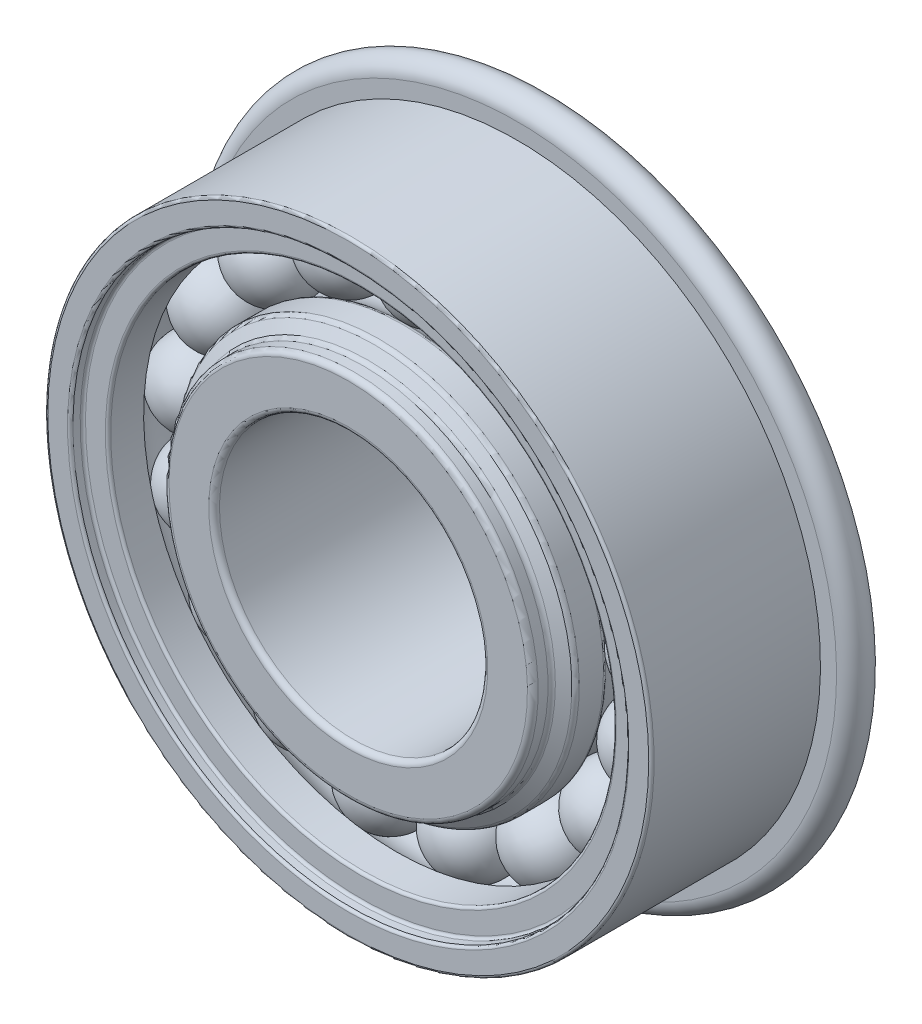
ISO-10303-21;
HEADER;
FILE_DESCRIPTION(('STEP AP214'),'2;1');
FILE_NAME('part.step','',(''),(''),'','','');
FILE_SCHEMA(('AUTOMOTIVE_DESIGN { 1 0 10303 214 1 1 1 1 }'));
ENDSEC;
DATA;
#1=APPLICATION_CONTEXT('core data for automotive mechanical design processes');
#2=APPLICATION_PROTOCOL_DEFINITION('international standard','automotive_design',2000,#1);
#3=PRODUCT_CONTEXT('',#1,'mechanical');
#4=PRODUCT('Part','Part','',(#3));
#5=PRODUCT_RELATED_PRODUCT_CATEGORY('part','',(#4));
#6=PRODUCT_DEFINITION_FORMATION('','',#4);
#7=PRODUCT_DEFINITION_CONTEXT('part definition',#1,'design');
#8=PRODUCT_DEFINITION('design','',#6,#7);
#9=PRODUCT_DEFINITION_SHAPE('','',#8);
#10=(LENGTH_UNIT() NAMED_UNIT(*) SI_UNIT(.MILLI.,.METRE.));
#11=(NAMED_UNIT(*) PLANE_ANGLE_UNIT() SI_UNIT($,.RADIAN.));
#12=(NAMED_UNIT(*) SI_UNIT($,.STERADIAN.) SOLID_ANGLE_UNIT());
#13=UNCERTAINTY_MEASURE_WITH_UNIT(LENGTH_MEASURE(1.E-05),#10,'distance_accuracy_value','');
#14=(GEOMETRIC_REPRESENTATION_CONTEXT(3) GLOBAL_UNCERTAINTY_ASSIGNED_CONTEXT((#13)) GLOBAL_UNIT_ASSIGNED_CONTEXT((#10,
#11,#12)) REPRESENTATION_CONTEXT('',''));
#15=CARTESIAN_POINT('',(0.,0.,0.));
#16=DIRECTION('',(0.,0.,1.));
#17=DIRECTION('',(1.,0.,0.));
#18=AXIS2_PLACEMENT_3D('',#15,#16,#17);
#19=CARTESIAN_POINT('',(-3.9649794970284,10.2347918781365,1.55575));
#20=DIRECTION('',(-0.361241666187141,0.932472229404361,0.));
#21=DIRECTION('',(0.,0.,-1.));
#22=AXIS2_PLACEMENT_3D('',#19,#20,#21);
#23=SPHERICAL_SURFACE('',#22,1.984375);
#24=CARTESIAN_POINT('',(-4.68181842836851,12.0851664583608,1.55575));
#25=VERTEX_POINT('',#24);
#26=VERTEX_LOOP('',#25);
#27=FACE_BOUND('',#26,.T.);
#28=ADVANCED_FACE('F46',(#27),#23,.T.);
#29=CLOSED_SHELL('',(#28));
#30=MANIFOLD_SOLID_BREP('B2',#29);
#31=CARTESIAN_POINT('',(-7.39446654227342,8.11134340019112,1.55575));
#32=DIRECTION('',(-0.673695643646548,0.739008917220668,0.));
#33=DIRECTION('',(0.,0.,-1.));
#34=AXIS2_PLACEMENT_3D('',#31,#32,#33);
#35=SPHERICAL_SURFACE('',#34,1.984375);
#36=CARTESIAN_POINT('',(-8.73133133513454,9.57781422030088,1.55575));
#37=VERTEX_POINT('',#36);
#38=VERTEX_LOOP('',#37);
#39=FACE_BOUND('',#38,.T.);
#40=ADVANCED_FACE('F63',(#39),#35,.T.);
#41=CLOSED_SHELL('',(#40));
#42=MANIFOLD_SOLID_BREP('B6',#41);
#43=CARTESIAN_POINT('',(-9.82528990683082,4.89241304954451,1.55575));
#44=DIRECTION('',(-0.895163291355057,0.445738355776549,0.));
#45=DIRECTION('',(0.,0.,-1.));
#46=AXIS2_PLACEMENT_3D('',#43,#44,#45);
#47=SPHERICAL_SURFACE('',#46,1.984375);
#48=CARTESIAN_POINT('',(-11.6016295631135,5.7769250992886,1.55575));
#49=VERTEX_POINT('',#48);
#50=VERTEX_LOOP('',#49);
#51=FACE_BOUND('',#50,.T.);
#52=ADVANCED_FACE('F84',(#51),#47,.T.);
#53=CLOSED_SHELL('',(#52));
#54=MANIFOLD_SOLID_BREP('B45',#53);
#55=CARTESIAN_POINT('',(-10.9291534256599,1.01273520676034,1.55575));
#56=DIRECTION('',(-0.995734176295033,0.092268359463313,0.));
#57=DIRECTION('',(0.,0.,-1.));
#58=AXIS2_PLACEMENT_3D('',#55,#56,#57);
#59=SPHERICAL_SURFACE('',#58,1.984375);
#60=CARTESIAN_POINT('',(-12.9050634317453,1.19583023257035,1.55575));
#61=VERTEX_POINT('',#60);
#62=VERTEX_LOOP('',#61);
#63=FACE_BOUND('',#62,.T.);
#64=ADVANCED_FACE('F105',(#63),#59,.T.);
#65=CLOSED_SHELL('',(#64));
#66=MANIFOLD_SOLID_BREP('B62',#65);
#67=CARTESIAN_POINT('',(-10.5569742138238,-3.00371813745632,1.55575));
#68=DIRECTION('',(-0.961825643172822,-0.273662990072073,0.));
#69=DIRECTION('',(0.,0.,-1.));
#70=AXIS2_PLACEMENT_3D('',#67,#68,#69);
#71=SPHERICAL_SURFACE('',#70,1.984375);
#72=CARTESIAN_POINT('',(-12.4655969744949,-3.54676813338059,1.55575));
#73=VERTEX_POINT('',#72);
#74=VERTEX_LOOP('',#73);
#75=FACE_BOUND('',#74,.T.);
#76=ADVANCED_FACE('F125',(#75),#71,.T.);
#77=CLOSED_SHELL('',(#76));
#78=MANIFOLD_SOLID_BREP('B77',#77);
#79=CARTESIAN_POINT('',(-8.75901713619728,-6.61450270303273,1.55575));
#80=DIRECTION('',(-0.798017227280245,-0.602634636379249,0.));
#81=DIRECTION('',(0.,0.,-1.));
#82=AXIS2_PLACEMENT_3D('',#79,#80,#81);
#83=SPHERICAL_SURFACE('',#82,1.984375);
#84=CARTESIAN_POINT('',(-10.3425825715815,-7.81035580959781,1.55575));
#85=VERTEX_POINT('',#84);
#86=VERTEX_LOOP('',#85);
#87=FACE_BOUND('',#86,.T.);
#88=ADVANCED_FACE('F142',(#87),#83,.T.);
#89=CLOSED_SHELL('',(#88));
#90=MANIFOLD_SOLID_BREP('B97',#89);
#91=CARTESIAN_POINT('',(-5.77810625893786,-9.33196202633981,1.55575));
#92=DIRECTION('',(-0.526432162877363,-0.85021713572961,0.));
#93=DIRECTION('',(0.,0.,-1.));
#94=AXIS2_PLACEMENT_3D('',#91,#92,#93);
#95=SPHERICAL_SURFACE('',#94,1.984375);
#96=CARTESIAN_POINT('',(-6.82274508214763,-11.0191116550533,1.55575));
#97=VERTEX_POINT('',#96);
#98=VERTEX_LOOP('',#97);
#99=FACE_BOUND('',#98,.T.);
#100=ADVANCED_FACE('F158',(#99),#95,.T.);
#101=CLOSED_SHELL('',(#100));
#102=MANIFOLD_SOLID_BREP('B118',#101);
#103=CARTESIAN_POINT('',(-2.01683011381681,-10.789088167803,1.55575));
#104=DIRECTION('',(-0.183749517816578,-0.9829730996839,0.));
#105=DIRECTION('',(0.,0.,-1.));
#106=AXIS2_PLACEMENT_3D('',#103,#104,#105);
#107=SPHERICAL_SURFACE('',#106,1.984375);
#108=CARTESIAN_POINT('',(-2.38145806323408,-12.7396754124882,1.55575));
#109=VERTEX_POINT('',#108);
#110=VERTEX_LOOP('',#109);
#111=FACE_BOUND('',#110,.T.);
#112=ADVANCED_FACE('F178',(#111),#107,.T.);
#113=CLOSED_SHELL('',(#112));
#114=MANIFOLD_SOLID_BREP('B140',#113);
#115=CARTESIAN_POINT('',(2.01683011381666,-10.789088167803,1.55575));
#116=DIRECTION('',(0.183749517816564,-0.982973099683903,0.));
#117=DIRECTION('',(0.,0.,-1.));
#118=AXIS2_PLACEMENT_3D('',#115,#116,#117);
#119=SPHERICAL_SURFACE('',#118,1.984375);
#120=CARTESIAN_POINT('',(2.3814580632339,-12.7396754124883,1.55575));
#121=VERTEX_POINT('',#120);
#122=VERTEX_LOOP('',#121);
#123=FACE_BOUND('',#122,.T.);
#124=ADVANCED_FACE('F198',(#123),#119,.T.);
#125=CLOSED_SHELL('',(#124));
#126=MANIFOLD_SOLID_BREP('B157',#125);
#127=CARTESIAN_POINT('',(5.77810625893773,-9.33196202633989,1.55575));
#128=DIRECTION('',(0.526432162877351,-0.850217135729617,0.));
#129=DIRECTION('',(0.,0.,-1.));
#130=AXIS2_PLACEMENT_3D('',#127,#128,#129);
#131=SPHERICAL_SURFACE('',#130,1.984375);
#132=CARTESIAN_POINT('',(6.82274508214747,-11.0191116550533,1.55575));
#133=VERTEX_POINT('',#132);
#134=VERTEX_LOOP('',#133);
#135=FACE_BOUND('',#134,.T.);
#136=ADVANCED_FACE('F219',(#135),#131,.T.);
#137=CLOSED_SHELL('',(#136));
#138=MANIFOLD_SOLID_BREP('B174',#137);
#139=CARTESIAN_POINT('',(8.75901713619719,-6.61450270303286,1.55575));
#140=DIRECTION('',(0.798017227280236,-0.602634636379261,0.));
#141=DIRECTION('',(0.,0.,-1.));
#142=AXIS2_PLACEMENT_3D('',#139,#140,#141);
#143=SPHERICAL_SURFACE('',#142,1.984375);
#144=CARTESIAN_POINT('',(10.3425825715814,-7.81035580959795,1.55575));
#145=VERTEX_POINT('',#144);
#146=VERTEX_LOOP('',#145);
#147=FACE_BOUND('',#146,.T.);
#148=ADVANCED_FACE('F237',(#147),#143,.T.);
#149=CLOSED_SHELL('',(#148));
#150=MANIFOLD_SOLID_BREP('B192',#149);
#151=CARTESIAN_POINT('',(10.5569742138238,-3.00371813745647,1.55575));
#152=DIRECTION('',(0.961825643172818,-0.273662990072087,0.));
#153=DIRECTION('',(0.,0.,-1.));
#154=AXIS2_PLACEMENT_3D('',#151,#152,#153);
#155=SPHERICAL_SURFACE('',#154,1.984375);
#156=CARTESIAN_POINT('',(12.4655969744948,-3.54676813338077,1.55575));
#157=VERTEX_POINT('',#156);
#158=VERTEX_LOOP('',#157);
#159=FACE_BOUND('',#158,.T.);
#160=ADVANCED_FACE('F252',(#159),#155,.T.);
#161=CLOSED_SHELL('',(#160));
#162=MANIFOLD_SOLID_BREP('B214',#161);
#163=CARTESIAN_POINT('',(10.9291534256599,1.01273520676018,1.55575));
#164=DIRECTION('',(0.995734176295035,0.0922683594632987,0.));
#165=DIRECTION('',(0.,0.,-1.));
#166=AXIS2_PLACEMENT_3D('',#163,#164,#165);
#167=SPHERICAL_SURFACE('',#166,1.984375);
#168=CARTESIAN_POINT('',(12.9050634317454,1.19583023257016,1.55575));
#169=VERTEX_POINT('',#168);
#170=VERTEX_LOOP('',#169);
#171=FACE_BOUND('',#170,.T.);
#172=ADVANCED_FACE('F272',(#171),#167,.T.);
#173=CLOSED_SHELL('',(#172));
#174=MANIFOLD_SOLID_BREP('B235',#173);
#175=CARTESIAN_POINT('',(9.82528990683089,4.89241304954436,1.55575));
#176=DIRECTION('',(0.895163291355063,0.445738355776536,0.));
#177=DIRECTION('',(0.,0.,-1.));
#178=AXIS2_PLACEMENT_3D('',#175,#176,#177);
#179=SPHERICAL_SURFACE('',#178,1.984375);
#180=CARTESIAN_POINT('',(11.6016295631136,5.77692509928843,1.55575));
#181=VERTEX_POINT('',#180);
#182=VERTEX_LOOP('',#181);
#183=FACE_BOUND('',#182,.T.);
#184=ADVANCED_FACE('F295',(#183),#179,.T.);
#185=CLOSED_SHELL('',(#184));
#186=MANIFOLD_SOLID_BREP('B254',#185);
#187=CARTESIAN_POINT('',(7.39446654227353,8.11134340019101,1.55575));
#188=DIRECTION('',(0.673695643646558,0.739008917220658,0.));
#189=DIRECTION('',(0.,0.,-1.));
#190=AXIS2_PLACEMENT_3D('',#187,#188,#189);
#191=SPHERICAL_SURFACE('',#190,1.984375);
#192=CARTESIAN_POINT('',(8.73133133513467,9.57781422030076,1.55575));
#193=VERTEX_POINT('',#192);
#194=VERTEX_LOOP('',#193);
#195=FACE_BOUND('',#194,.T.);
#196=ADVANCED_FACE('F315',(#195),#191,.T.);
#197=CLOSED_SHELL('',(#196));
#198=MANIFOLD_SOLID_BREP('B269',#197);
#199=CARTESIAN_POINT('',(3.96497949702854,10.2347918781365,1.55575));
#200=DIRECTION('',(0.361241666187154,0.932472229404355,0.));
#201=DIRECTION('',(0.,0.,-1.));
#202=AXIS2_PLACEMENT_3D('',#199,#200,#201);
#203=SPHERICAL_SURFACE('',#202,1.984375);
#204=CARTESIAN_POINT('',(4.68181842836868,12.0851664583607,1.55575));
#205=VERTEX_POINT('',#204);
#206=VERTEX_LOOP('',#205);
#207=FACE_BOUND('',#206,.T.);
#208=ADVANCED_FACE('F333',(#207),#203,.T.);
#209=CLOSED_SHELL('',(#208));
#210=MANIFOLD_SOLID_BREP('B286',#209);
#211=CARTESIAN_POINT('',(0.,10.975975,1.55575));
#212=DIRECTION('',(0.,1.,0.));
#213=DIRECTION('',(0.,0.,-1.));
#214=AXIS2_PLACEMENT_3D('',#211,#212,#213);
#215=SPHERICAL_SURFACE('',#214,1.984375);
#216=CARTESIAN_POINT('',(0.,12.96035,1.55575));
#217=VERTEX_POINT('',#216);
#218=VERTEX_LOOP('',#217);
#219=FACE_BOUND('',#218,.T.);
#220=ADVANCED_FACE('F355',(#219),#215,.T.);
#221=CLOSED_SHELL('',(#220));
#222=MANIFOLD_SOLID_BREP('B306',#221);
#223=CARTESIAN_POINT('',(0.,8.7376,-5.55625));
#224=DIRECTION('',(0.,0.,1.));
#225=DIRECTION('',(0.,-1.,0.));
#226=AXIS2_PLACEMENT_3D('',#223,#224,#225);
#227=PLANE('',#226);
#228=CARTESIAN_POINT('',(0.,0.,-5.55625));
#229=DIRECTION('',(0.,0.,1.));
#230=DIRECTION('',(0.,-1.,0.));
#231=AXIS2_PLACEMENT_3D('',#228,#229,#230);
#232=CIRCLE('',#231,7.89273360666771);
#233=CARTESIAN_POINT('',(0.,-7.89273360666771,-5.55625));
#234=VERTEX_POINT('',#233);
#235=EDGE_CURVE('E351',#234,#234,#232,.F.);
#236=ORIENTED_EDGE('',*,*,#235,.T.);
#237=EDGE_LOOP('',(#236));
#238=FACE_BOUND('',#237,.T.);
#239=CARTESIAN_POINT('',(0.,0.,-5.55625));
#240=DIRECTION('',(0.,0.,1.));
#241=DIRECTION('',(0.,-1.,0.));
#242=AXIS2_PLACEMENT_3D('',#239,#240,#241);
#243=CIRCLE('',#242,7.69775385926724);
#244=CARTESIAN_POINT('',(0.,-7.69775385926724,-5.55625));
#245=VERTEX_POINT('',#244);
#246=EDGE_CURVE('E449',#245,#245,#243,.T.);
#247=ORIENTED_EDGE('',*,*,#246,.T.);
#248=EDGE_LOOP('',(#247));
#249=FACE_BOUND('',#248,.T.);
#250=ADVANCED_FACE('F375',(#238,#249),#227,.F.);
#251=CARTESIAN_POINT('',(0.,0.,5.55625));
#252=DIRECTION('',(0.,0.,1.));
#253=DIRECTION('',(0.,-1.,0.));
#254=AXIS2_PLACEMENT_3D('',#251,#252,#253);
#255=CYLINDRICAL_SURFACE('',#254,8.7376);
#256=CARTESIAN_POINT('',(0.,0.,-5.10328333333334));
#257=DIRECTION('',(0.,0.,-1.));
#258=DIRECTION('',(0.,1.,0.));
#259=AXIS2_PLACEMENT_3D('',#256,#257,#258);
#260=CIRCLE('',#259,8.7376);
#261=CARTESIAN_POINT('',(0.,8.7376,-5.10328333333333));
#262=VERTEX_POINT('',#261);
#263=EDGE_CURVE('E444',#262,#262,#260,.F.);
#264=ORIENTED_EDGE('',*,*,#263,.T.);
#265=EDGE_LOOP('',(#264));
#266=FACE_BOUND('',#265,.T.);
#267=CARTESIAN_POINT('',(0.,0.,-2.59139696837417));
#268=DIRECTION('',(0.,0.,1.));
#269=DIRECTION('',(0.,-1.,0.));
#270=AXIS2_PLACEMENT_3D('',#267,#268,#269);
#271=CIRCLE('',#270,8.7376);
#272=CARTESIAN_POINT('',(0.,-8.7376,-2.59139696837417));
#273=VERTEX_POINT('',#272);
#274=EDGE_CURVE('E448',#273,#273,#271,.F.);
#275=ORIENTED_EDGE('',*,*,#274,.T.);
#276=EDGE_LOOP('',(#275));
#277=FACE_BOUND('',#276,.T.);
#278=ADVANCED_FACE('F510',(#266,#277),#255,.T.);
#279=CARTESIAN_POINT('',(0.,0.,5.55625));
#280=DIRECTION('',(0.,0.,1.));
#281=DIRECTION('',(0.,-1.,0.));
#282=AXIS2_PLACEMENT_3D('',#279,#280,#281);
#283=CYLINDRICAL_SURFACE('',#282,6.35);
#284=CARTESIAN_POINT('',(0.,0.,5.30225));
#285=DIRECTION('',(0.,0.,-1.));
#286=DIRECTION('',(0.,1.,0.));
#287=AXIS2_PLACEMENT_3D('',#284,#285,#286);
#288=CIRCLE('',#287,6.35);
#289=CARTESIAN_POINT('',(0.,6.35,5.30225));
#290=VERTEX_POINT('',#289);
#291=EDGE_CURVE('E377',#290,#290,#288,.F.);
#292=ORIENTED_EDGE('',*,*,#291,.T.);
#293=EDGE_LOOP('',(#292));
#294=FACE_BOUND('',#293,.T.);
#295=CARTESIAN_POINT('',(0.,0.,-4.77835477495109));
#296=DIRECTION('',(0.,0.,-1.));
#297=DIRECTION('',(0.,1.,0.));
#298=AXIS2_PLACEMENT_3D('',#295,#296,#297);
#299=CIRCLE('',#298,6.35);
#300=CARTESIAN_POINT('',(0.,6.35,-4.77835477495109));
#301=VERTEX_POINT('',#300);
#302=EDGE_CURVE('E488',#301,#301,#299,.T.);
#303=ORIENTED_EDGE('',*,*,#302,.T.);
#304=EDGE_LOOP('',(#303));
#305=FACE_BOUND('',#304,.T.);
#306=ADVANCED_FACE('F514',(#294,#305),#283,.F.);
#307=CARTESIAN_POINT('',(0.,6.35,5.55625));
#308=DIRECTION('',(0.,0.,-1.));
#309=DIRECTION('',(0.,1.,0.));
#310=AXIS2_PLACEMENT_3D('',#307,#308,#309);
#311=PLANE('',#310);
#312=CARTESIAN_POINT('',(0.,0.,5.55625));
#313=DIRECTION('',(0.,0.,-1.));
#314=DIRECTION('',(0.,1.,0.));
#315=AXIS2_PLACEMENT_3D('',#312,#313,#314);
#316=CIRCLE('',#315,8.4836);
#317=CARTESIAN_POINT('',(0.,8.4836,5.55625));
#318=VERTEX_POINT('',#317);
#319=EDGE_CURVE('E387',#318,#318,#316,.F.);
#320=ORIENTED_EDGE('',*,*,#319,.T.);
#321=EDGE_LOOP('',(#320));
#322=FACE_BOUND('',#321,.T.);
#323=CARTESIAN_POINT('',(0.,0.,5.55625));
#324=DIRECTION('',(0.,0.,-1.));
#325=DIRECTION('',(0.,1.,0.));
#326=AXIS2_PLACEMENT_3D('',#323,#324,#325);
#327=CIRCLE('',#326,6.604);
#328=CARTESIAN_POINT('',(0.,6.604,5.55625));
#329=VERTEX_POINT('',#328);
#330=EDGE_CURVE('E394',#329,#329,#327,.T.);
#331=ORIENTED_EDGE('',*,*,#330,.T.);
#332=EDGE_LOOP('',(#331));
#333=FACE_BOUND('',#332,.T.);
#334=ADVANCED_FACE('F523',(#322,#333),#311,.F.);
#335=CARTESIAN_POINT('',(0.,0.,-2.44475));
#336=DIRECTION('',(0.,0.,1.));
#337=DIRECTION('',(0.,-1.,0.));
#338=AXIS2_PLACEMENT_3D('',#335,#336,#337);
#339=CONICAL_SURFACE('',#338,8.7376,1.0471975511966);
#340=CARTESIAN_POINT('',(0.,0.,-2.37142651581292));
#341=DIRECTION('',(0.,0.,1.));
#342=DIRECTION('',(0.,-1.,0.));
#343=AXIS2_PLACEMENT_3D('',#340,#341,#342);
#344=CIRCLE('',#343,8.8646);
#345=CARTESIAN_POINT('',(0.,-8.8646,-2.37142651581292));
#346=VERTEX_POINT('',#345);
#347=EDGE_CURVE('E431',#346,#346,#344,.T.);
#348=ORIENTED_EDGE('',*,*,#347,.T.);
#349=EDGE_LOOP('',(#348));
#350=FACE_BOUND('',#349,.T.);
#351=CARTESIAN_POINT('',(0.,0.,-2.01168317152005));
#352=DIRECTION('',(0.,0.,1.));
#353=DIRECTION('',(0.,-1.,0.));
#354=AXIS2_PLACEMENT_3D('',#351,#352,#353);
#355=CIRCLE('',#354,9.48769375);
#356=CARTESIAN_POINT('',(0.,-9.48769375,-2.01168317152005));
#357=VERTEX_POINT('',#356);
#358=EDGE_CURVE('E453',#357,#357,#355,.T.);
#359=ORIENTED_EDGE('',*,*,#358,.F.);
#360=EDGE_LOOP('',(#359));
#361=FACE_BOUND('',#360,.T.);
#362=ADVANCED_FACE('F522',(#350,#361),#339,.T.);
#363=CARTESIAN_POINT('',(0.,0.,5.55625));
#364=DIRECTION('',(0.,0.,1.));
#365=DIRECTION('',(0.,-1.,0.));
#366=AXIS2_PLACEMENT_3D('',#363,#364,#365);
#367=CYLINDRICAL_SURFACE('',#366,9.48769375);
#368=CARTESIAN_POINT('',(0.,0.,0.150481809751802));
#369=DIRECTION('',(0.,0.,-1.));
#370=DIRECTION('',(0.,1.,0.));
#371=AXIS2_PLACEMENT_3D('',#368,#369,#370);
#372=CIRCLE('',#371,9.48769375);
#373=CARTESIAN_POINT('',(0.,9.48769375,0.150481809751804));
#374=VERTEX_POINT('',#373);
#375=EDGE_CURVE('E425',#374,#374,#372,.T.);
#376=ORIENTED_EDGE('',*,*,#375,.T.);
#377=EDGE_LOOP('',(#376));
#378=FACE_BOUND('',#377,.T.);
#379=ORIENTED_EDGE('',*,*,#358,.T.);
#380=EDGE_LOOP('',(#379));
#381=FACE_BOUND('',#380,.T.);
#382=ADVANCED_FACE('F594',(#378,#381),#367,.T.);
#383=CARTESIAN_POINT('',(0.,0.,1.55575));
#384=DIRECTION('',(0.,0.,1.));
#385=DIRECTION('',(0.,-1.,0.));
#386=AXIS2_PLACEMENT_3D('',#383,#384,#385);
#387=TOROIDAL_SURFACE('',#386,10.975975,1.984375);
#388=CARTESIAN_POINT('',(0.,0.,0.309944866801238));
#389=DIRECTION('',(0.,0.,1.));
#390=DIRECTION('',(0.,-1.,0.));
#391=AXIS2_PLACEMENT_3D('',#388,#389,#390);
#392=CIRCLE('',#391,9.43139942375886);
#393=CARTESIAN_POINT('',(0.,-9.43139942375886,0.309944866801237));
#394=VERTEX_POINT('',#393);
#395=EDGE_CURVE('E426',#394,#394,#392,.T.);
#396=ORIENTED_EDGE('',*,*,#395,.T.);
#397=EDGE_LOOP('',(#396));
#398=FACE_BOUND('',#397,.T.);
#399=CARTESIAN_POINT('',(0.,0.,2.80155513319875));
#400=DIRECTION('',(0.,0.,-1.));
#401=DIRECTION('',(0.,1.,0.));
#402=AXIS2_PLACEMENT_3D('',#399,#400,#401);
#403=CIRCLE('',#402,9.43139942375887);
#404=CARTESIAN_POINT('',(0.,9.43139942375887,2.80155513319876));
#405=VERTEX_POINT('',#404);
#406=EDGE_CURVE('E429',#405,#405,#403,.T.);
#407=ORIENTED_EDGE('',*,*,#406,.T.);
#408=EDGE_LOOP('',(#407));
#409=FACE_BOUND('',#408,.T.);
#410=ADVANCED_FACE('F589',(#398,#409),#387,.F.);
#411=CARTESIAN_POINT('',(0.,0.,5.55625));
#412=DIRECTION('',(0.,0.,1.));
#413=DIRECTION('',(0.,-1.,0.));
#414=AXIS2_PLACEMENT_3D('',#411,#412,#413);
#415=CYLINDRICAL_SURFACE('',#414,9.48769375);
#416=CARTESIAN_POINT('',(0.,0.,2.96101819024819));
#417=DIRECTION('',(0.,0.,-1.));
#418=DIRECTION('',(0.,1.,0.));
#419=AXIS2_PLACEMENT_3D('',#416,#417,#418);
#420=CIRCLE('',#419,9.48769375);
#421=CARTESIAN_POINT('',(0.,9.48769375,2.9610181902482));
#422=VERTEX_POINT('',#421);
#423=EDGE_CURVE('E414',#422,#422,#420,.F.);
#424=ORIENTED_EDGE('',*,*,#423,.T.);
#425=EDGE_LOOP('',(#424));
#426=FACE_BOUND('',#425,.T.);
#427=CARTESIAN_POINT('',(0.,0.,4.11040254618597));
#428=DIRECTION('',(0.,0.,-1.));
#429=DIRECTION('',(0.,1.,0.));
#430=AXIS2_PLACEMENT_3D('',#427,#428,#429);
#431=CIRCLE('',#430,9.48769375);
#432=CARTESIAN_POINT('',(0.,9.48769375,4.11040254618597));
#433=VERTEX_POINT('',#432);
#434=EDGE_CURVE('E418',#433,#433,#431,.T.);
#435=ORIENTED_EDGE('',*,*,#434,.T.);
#436=EDGE_LOOP('',(#435));
#437=FACE_BOUND('',#436,.T.);
#438=ADVANCED_FACE('F582',(#426,#437),#415,.T.);
#439=CARTESIAN_POINT('',(0.,0.,4.25704951456013));
#440=DIRECTION('',(0.,0.,-1.));
#441=DIRECTION('',(0.,1.,0.));
#442=AXIS2_PLACEMENT_3D('',#439,#440,#441);
#443=CONICAL_SURFACE('',#442,9.48769375,1.0471975511966);
#444=CARTESIAN_POINT('',(0.,0.,4.33037299874722));
#445=DIRECTION('',(0.,0.,1.));
#446=DIRECTION('',(0.,-1.,0.));
#447=AXIS2_PLACEMENT_3D('',#444,#445,#446);
#448=CIRCLE('',#447,9.36069375);
#449=CARTESIAN_POINT('',(0.,-9.36069375,4.33037299874721));
#450=VERTEX_POINT('',#449);
#451=EDGE_CURVE('E408',#450,#450,#448,.T.);
#452=ORIENTED_EDGE('',*,*,#451,.T.);
#453=EDGE_LOOP('',(#452));
#454=FACE_BOUND('',#453,.T.);
#455=CARTESIAN_POINT('',(0.,0.,4.616792858853));
#456=DIRECTION('',(0.,0.,-1.));
#457=DIRECTION('',(0.,1.,0.));
#458=AXIS2_PLACEMENT_3D('',#455,#456,#457);
#459=CIRCLE('',#458,8.8646);
#460=CARTESIAN_POINT('',(0.,8.8646,4.616792858853));
#461=VERTEX_POINT('',#460);
#462=EDGE_CURVE('E409',#461,#461,#459,.T.);
#463=ORIENTED_EDGE('',*,*,#462,.T.);
#464=EDGE_LOOP('',(#463));
#465=FACE_BOUND('',#464,.T.);
#466=ADVANCED_FACE('F569',(#454,#465),#443,.T.);
#467=CARTESIAN_POINT('',(0.,0.,5.55625));
#468=DIRECTION('',(0.,0.,1.));
#469=DIRECTION('',(0.,-1.,0.));
#470=AXIS2_PLACEMENT_3D('',#467,#468,#469);
#471=CYLINDRICAL_SURFACE('',#470,8.7376);
#472=CARTESIAN_POINT('',(0.,0.,4.83676331141425));
#473=DIRECTION('',(0.,0.,1.));
#474=DIRECTION('',(0.,-1.,0.));
#475=AXIS2_PLACEMENT_3D('',#472,#473,#474);
#476=CIRCLE('',#475,8.7376);
#477=CARTESIAN_POINT('',(0.,-8.7376,4.83676331141425));
#478=VERTEX_POINT('',#477);
#479=EDGE_CURVE('E396',#478,#478,#476,.T.);
#480=ORIENTED_EDGE('',*,*,#479,.T.);
#481=EDGE_LOOP('',(#480));
#482=FACE_BOUND('',#481,.T.);
#483=CARTESIAN_POINT('',(0.,0.,5.30225));
#484=DIRECTION('',(0.,0.,-1.));
#485=DIRECTION('',(0.,1.,0.));
#486=AXIS2_PLACEMENT_3D('',#483,#484,#485);
#487=CIRCLE('',#486,8.7376);
#488=CARTESIAN_POINT('',(0.,8.7376,5.30225));
#489=VERTEX_POINT('',#488);
#490=EDGE_CURVE('E401',#489,#489,#487,.T.);
#491=ORIENTED_EDGE('',*,*,#490,.T.);
#492=EDGE_LOOP('',(#491));
#493=FACE_BOUND('',#492,.T.);
#494=ADVANCED_FACE('F570',(#482,#493),#471,.T.);
#495=CARTESIAN_POINT('',(0.,0.,-4.82021452036773));
#496=DIRECTION('',(0.,0.,1.));
#497=DIRECTION('',(0.,-1.,0.));
#498=AXIS2_PLACEMENT_3D('',#495,#496,#497);
#499=TOROIDAL_SURFACE('',#498,7.14412011236812,0.508);
#500=CARTESIAN_POINT('',(0.,0.,-5.31090484012258));
#501=DIRECTION('',(0.,0.,1.));
#502=DIRECTION('',(0.,-1.,0.));
#503=AXIS2_PLACEMENT_3D('',#500,#501,#502);
#504=CIRCLE('',#503,7.01264003745604);
#505=CARTESIAN_POINT('',(0.,-7.01264003745604,-5.31090484012258));
#506=VERTEX_POINT('',#505);
#507=EDGE_CURVE('E480',#506,#506,#504,.T.);
#508=ORIENTED_EDGE('',*,*,#507,.T.);
#509=EDGE_LOOP('',(#508));
#510=FACE_BOUND('',#509,.T.);
#511=CARTESIAN_POINT('',(0.,0.,-4.86448963768354));
#512=DIRECTION('',(0.,0.,1.));
#513=DIRECTION('',(0.,-1.,0.));
#514=AXIS2_PLACEMENT_3D('',#511,#512,#513);
#515=CIRCLE('',#514,6.63805320573751);
#516=CARTESIAN_POINT('',(0.,-6.63805320573751,-4.86448963768354));
#517=VERTEX_POINT('',#516);
#518=EDGE_CURVE('E456',#517,#517,#515,.T.);
#519=ORIENTED_EDGE('',*,*,#518,.F.);
#520=EDGE_LOOP('',(#519));
#521=FACE_BOUND('',#520,.T.);
#522=ADVANCED_FACE('F567',(#510,#521),#499,.F.);
#523=CARTESIAN_POINT('',(0.,0.,-3.96875));
#524=DIRECTION('',(0.,0.,-1.));
#525=DIRECTION('',(0.,1.,0.));
#526=AXIS2_PLACEMENT_3D('',#523,#524,#525);
#527=CONICAL_SURFACE('',#526,6.55968614196938,0.0872664625997155);
#528=ORIENTED_EDGE('',*,*,#518,.T.);
#529=EDGE_LOOP('',(#528));
#530=FACE_BOUND('',#529,.T.);
#531=CARTESIAN_POINT('',(0.,0.,-3.96875));
#532=DIRECTION('',(0.,0.,1.));
#533=DIRECTION('',(0.,-1.,0.));
#534=AXIS2_PLACEMENT_3D('',#531,#532,#533);
#535=CIRCLE('',#534,6.55968614196938);
#536=CARTESIAN_POINT('',(0.,-6.55968614196938,-3.96875));
#537=VERTEX_POINT('',#536);
#538=EDGE_CURVE('E465',#537,#537,#535,.T.);
#539=ORIENTED_EDGE('',*,*,#538,.F.);
#540=EDGE_LOOP('',(#539));
#541=FACE_BOUND('',#540,.T.);
#542=ADVANCED_FACE('F577',(#530,#541),#527,.T.);
#543=CARTESIAN_POINT('',(0.,6.55968614196938,-3.96875));
#544=DIRECTION('',(0.,0.,-1.));
#545=DIRECTION('',(0.,1.,0.));
#546=AXIS2_PLACEMENT_3D('',#543,#544,#545);
#547=PLANE('',#546);
#548=ORIENTED_EDGE('',*,*,#538,.T.);
#549=EDGE_LOOP('',(#548));
#550=FACE_BOUND('',#549,.T.);
#551=CARTESIAN_POINT('',(0.,0.,-3.96875));
#552=DIRECTION('',(0.,0.,1.));
#553=DIRECTION('',(0.,-1.,0.));
#554=AXIS2_PLACEMENT_3D('',#551,#552,#553);
#555=CIRCLE('',#554,6.68717126133739);
#556=CARTESIAN_POINT('',(0.,-6.68717126133739,-3.96875));
#557=VERTEX_POINT('',#556);
#558=EDGE_CURVE('E467',#557,#557,#555,.T.);
#559=ORIENTED_EDGE('',*,*,#558,.F.);
#560=EDGE_LOOP('',(#559));
#561=FACE_BOUND('',#560,.T.);
#562=ADVANCED_FACE('F652',(#550,#561),#547,.T.);
#563=CARTESIAN_POINT('',(0.,0.,-4.85342085835459));
#564=DIRECTION('',(0.,0.,-1.));
#565=DIRECTION('',(0.,1.,0.));
#566=AXIS2_PLACEMENT_3D('',#563,#564,#565);
#567=CONICAL_SURFACE('',#566,6.76456993239516,0.0872664625997166);
#568=ORIENTED_EDGE('',*,*,#558,.T.);
#569=EDGE_LOOP('',(#568));
#570=FACE_BOUND('',#569,.T.);
#571=CARTESIAN_POINT('',(0.,0.,-4.85342085835459));
#572=DIRECTION('',(0.,0.,1.));
#573=DIRECTION('',(0.,-1.,0.));
#574=AXIS2_PLACEMENT_3D('',#571,#572,#573);
#575=CIRCLE('',#574,6.76456993239516);
#576=CARTESIAN_POINT('',(0.,-6.76456993239516,-4.85342085835459));
#577=VERTEX_POINT('',#576);
#578=EDGE_CURVE('E468',#577,#577,#575,.T.);
#579=ORIENTED_EDGE('',*,*,#578,.F.);
#580=EDGE_LOOP('',(#579));
#581=FACE_BOUND('',#580,.T.);
#582=ADVANCED_FACE('F665',(#570,#581),#567,.F.);
#583=CARTESIAN_POINT('',(0.,0.,-4.82021452036773));
#584=DIRECTION('',(0.,0.,1.));
#585=DIRECTION('',(0.,-1.,0.));
#586=AXIS2_PLACEMENT_3D('',#583,#584,#585);
#587=TOROIDAL_SURFACE('',#586,7.14412011236812,0.381);
#588=ORIENTED_EDGE('',*,*,#578,.T.);
#589=EDGE_LOOP('',(#588));
#590=FACE_BOUND('',#589,.T.);
#591=CARTESIAN_POINT('',(0.,0.,-5.18823226018387));
#592=DIRECTION('',(0.,0.,1.));
#593=DIRECTION('',(0.,-1.,0.));
#594=AXIS2_PLACEMENT_3D('',#591,#592,#593);
#595=CIRCLE('',#594,7.04551005618406);
#596=CARTESIAN_POINT('',(0.,-7.04551005618405,-5.18823226018387));
#597=VERTEX_POINT('',#596);
#598=EDGE_CURVE('E472',#597,#597,#595,.T.);
#599=ORIENTED_EDGE('',*,*,#598,.F.);
#600=EDGE_LOOP('',(#599));
#601=FACE_BOUND('',#600,.T.);
#602=ADVANCED_FACE('F675',(#590,#601),#587,.T.);
#603=CARTESIAN_POINT('',(0.,0.,-5.31090484012258));
#604=DIRECTION('',(0.,0.,1.));
#605=DIRECTION('',(0.,-1.,0.));
#606=AXIS2_PLACEMENT_3D('',#603,#604,#605);
#607=CONICAL_SURFACE('',#606,7.01264003745604,0.26179938779915);
#608=ORIENTED_EDGE('',*,*,#507,.F.);
#609=EDGE_LOOP('',(#608));
#610=FACE_BOUND('',#609,.T.);
#611=CARTESIAN_POINT('',(0.,0.,-5.55625));
#612=DIRECTION('',(0.,0.,-1.));
#613=DIRECTION('',(0.,1.,0.));
#614=AXIS2_PLACEMENT_3D('',#611,#612,#613);
#615=CIRCLE('',#614,6.9469);
#616=CARTESIAN_POINT('',(0.,6.9469,-5.55625));
#617=VERTEX_POINT('',#616);
#618=EDGE_CURVE('E482',#617,#617,#615,.T.);
#619=ORIENTED_EDGE('',*,*,#618,.F.);
#620=EDGE_LOOP('',(#619));
#621=FACE_BOUND('',#620,.T.);
#622=ADVANCED_FACE('F527',(#610,#621),#607,.T.);
#623=CARTESIAN_POINT('',(0.,0.,-4.79425));
#624=DIRECTION('',(0.,0.,1.));
#625=DIRECTION('',(0.,-1.,0.));
#626=AXIS2_PLACEMENT_3D('',#623,#624,#625);
#627=TOROIDAL_SURFACE('',#626,7.69775385926724,0.762);
#628=ORIENTED_EDGE('',*,*,#598,.T.);
#629=EDGE_LOOP('',(#628));
#630=FACE_BOUND('',#629,.T.);
#631=ORIENTED_EDGE('',*,*,#246,.F.);
#632=EDGE_LOOP('',(#631));
#633=FACE_BOUND('',#632,.T.);
#634=ADVANCED_FACE('F529',(#630,#633),#627,.T.);
#635=CARTESIAN_POINT('',(0.,0.,-4.77835477495109));
#636=DIRECTION('',(0.,0.,-1.));
#637=DIRECTION('',(0.,1.,0.));
#638=AXIS2_PLACEMENT_3D('',#635,#636,#637);
#639=TOROIDAL_SURFACE('',#638,7.15533639734788,0.805336397347879);
#640=ORIENTED_EDGE('',*,*,#618,.T.);
#641=EDGE_LOOP('',(#640));
#642=FACE_BOUND('',#641,.T.);
#643=ORIENTED_EDGE('',*,*,#302,.F.);
#644=EDGE_LOOP('',(#643));
#645=FACE_BOUND('',#644,.T.);
#646=ADVANCED_FACE('F528',(#642,#645),#639,.T.);
#647=CARTESIAN_POINT('',(0.,8.33966666666667,-5.35728333333333));
#648=DIRECTION('',(0.,0.,-1.));
#649=DIRECTION('',(0.,1.,0.));
#650=AXIS2_PLACEMENT_3D('',#647,#648,#649);
#651=PLANE('',#650);
#652=CARTESIAN_POINT('',(0.,0.,-5.35728333333334));
#653=DIRECTION('',(0.,0.,-1.));
#654=DIRECTION('',(0.,1.,0.));
#655=AXIS2_PLACEMENT_3D('',#652,#653,#654);
#656=CIRCLE('',#655,8.4836);
#657=CARTESIAN_POINT('',(0.,8.4836,-5.35728333333333));
#658=VERTEX_POINT('',#657);
#659=EDGE_CURVE('E439',#658,#658,#656,.T.);
#660=ORIENTED_EDGE('',*,*,#659,.T.);
#661=EDGE_LOOP('',(#660));
#662=FACE_BOUND('',#661,.T.);
#663=CARTESIAN_POINT('',(0.,0.,-5.35728333333333));
#664=DIRECTION('',(0.,0.,1.));
#665=DIRECTION('',(0.,-1.,0.));
#666=AXIS2_PLACEMENT_3D('',#663,#664,#665);
#667=CIRCLE('',#666,8.1407);
#668=CARTESIAN_POINT('',(0.,-8.1407,-5.35728333333334));
#669=VERTEX_POINT('',#668);
#670=EDGE_CURVE('E487',#669,#669,#667,.T.);
#671=ORIENTED_EDGE('',*,*,#670,.T.);
#672=EDGE_LOOP('',(#671));
#673=FACE_BOUND('',#672,.T.);
#674=ADVANCED_FACE('F496',(#662,#673),#651,.T.);
#675=CARTESIAN_POINT('',(0.,0.,-5.10328333333334));
#676=DIRECTION('',(0.,0.,-1.));
#677=DIRECTION('',(0.,1.,0.));
#678=AXIS2_PLACEMENT_3D('',#675,#676,#677);
#679=TOROIDAL_SURFACE('',#678,8.4836,0.254);
#680=ORIENTED_EDGE('',*,*,#659,.F.);
#681=EDGE_LOOP('',(#680));
#682=FACE_BOUND('',#681,.T.);
#683=ORIENTED_EDGE('',*,*,#263,.F.);
#684=EDGE_LOOP('',(#683));
#685=FACE_BOUND('',#684,.T.);
#686=ADVANCED_FACE('F535',(#682,#685),#679,.T.);
#687=CARTESIAN_POINT('',(0.,0.,-2.59139696837417));
#688=DIRECTION('',(0.,0.,1.));
#689=DIRECTION('',(0.,-1.,0.));
#690=AXIS2_PLACEMENT_3D('',#687,#688,#689);
#691=TOROIDAL_SURFACE('',#690,8.9916,0.254);
#692=ORIENTED_EDGE('',*,*,#274,.F.);
#693=EDGE_LOOP('',(#692));
#694=FACE_BOUND('',#693,.T.);
#695=ORIENTED_EDGE('',*,*,#347,.F.);
#696=EDGE_LOOP('',(#695));
#697=FACE_BOUND('',#696,.T.);
#698=ADVANCED_FACE('F533',(#694,#697),#691,.F.);
#699=CARTESIAN_POINT('',(0.,0.,0.150481809751802));
#700=DIRECTION('',(0.,0.,-1.));
#701=DIRECTION('',(0.,1.,0.));
#702=AXIS2_PLACEMENT_3D('',#699,#700,#701);
#703=TOROIDAL_SURFACE('',#702,9.23369375,0.254);
#704=ORIENTED_EDGE('',*,*,#375,.F.);
#705=EDGE_LOOP('',(#704));
#706=FACE_BOUND('',#705,.T.);
#707=ORIENTED_EDGE('',*,*,#395,.F.);
#708=EDGE_LOOP('',(#707));
#709=FACE_BOUND('',#708,.T.);
#710=ADVANCED_FACE('F536',(#706,#709),#703,.T.);
#711=CARTESIAN_POINT('',(0.,0.,2.96101819024819));
#712=DIRECTION('',(0.,0.,-1.));
#713=DIRECTION('',(0.,1.,0.));
#714=AXIS2_PLACEMENT_3D('',#711,#712,#713);
#715=TOROIDAL_SURFACE('',#714,9.23369375,0.254);
#716=ORIENTED_EDGE('',*,*,#406,.F.);
#717=EDGE_LOOP('',(#716));
#718=FACE_BOUND('',#717,.T.);
#719=ORIENTED_EDGE('',*,*,#423,.F.);
#720=EDGE_LOOP('',(#719));
#721=FACE_BOUND('',#720,.T.);
#722=ADVANCED_FACE('F545',(#718,#721),#715,.T.);
#723=CARTESIAN_POINT('',(0.,0.,4.11040254618597));
#724=DIRECTION('',(0.,0.,-1.));
#725=DIRECTION('',(0.,1.,0.));
#726=AXIS2_PLACEMENT_3D('',#723,#724,#725);
#727=TOROIDAL_SURFACE('',#726,9.23369375,0.254);
#728=ORIENTED_EDGE('',*,*,#434,.F.);
#729=EDGE_LOOP('',(#728));
#730=FACE_BOUND('',#729,.T.);
#731=ORIENTED_EDGE('',*,*,#451,.F.);
#732=EDGE_LOOP('',(#731));
#733=FACE_BOUND('',#732,.T.);
#734=ADVANCED_FACE('F550',(#730,#733),#727,.T.);
#735=CARTESIAN_POINT('',(0.,0.,4.83676331141425));
#736=DIRECTION('',(0.,0.,1.));
#737=DIRECTION('',(0.,-1.,0.));
#738=AXIS2_PLACEMENT_3D('',#735,#736,#737);
#739=TOROIDAL_SURFACE('',#738,8.9916,0.254);
#740=ORIENTED_EDGE('',*,*,#462,.F.);
#741=EDGE_LOOP('',(#740));
#742=FACE_BOUND('',#741,.T.);
#743=ORIENTED_EDGE('',*,*,#479,.F.);
#744=EDGE_LOOP('',(#743));
#745=FACE_BOUND('',#744,.T.);
#746=ADVANCED_FACE('F554',(#742,#745),#739,.F.);
#747=CARTESIAN_POINT('',(0.,0.,5.30225));
#748=DIRECTION('',(0.,0.,-1.));
#749=DIRECTION('',(0.,1.,0.));
#750=AXIS2_PLACEMENT_3D('',#747,#748,#749);
#751=TOROIDAL_SURFACE('',#750,8.4836,0.254);
#752=ORIENTED_EDGE('',*,*,#490,.F.);
#753=EDGE_LOOP('',(#752));
#754=FACE_BOUND('',#753,.T.);
#755=ORIENTED_EDGE('',*,*,#319,.F.);
#756=EDGE_LOOP('',(#755));
#757=FACE_BOUND('',#756,.T.);
#758=ADVANCED_FACE('F503',(#754,#757),#751,.T.);
#759=CARTESIAN_POINT('',(0.,0.,5.30225));
#760=DIRECTION('',(0.,0.,-1.));
#761=DIRECTION('',(0.,1.,0.));
#762=AXIS2_PLACEMENT_3D('',#759,#760,#761);
#763=TOROIDAL_SURFACE('',#762,6.604,0.254);
#764=ORIENTED_EDGE('',*,*,#330,.F.);
#765=EDGE_LOOP('',(#764));
#766=FACE_BOUND('',#765,.T.);
#767=ORIENTED_EDGE('',*,*,#291,.F.);
#768=EDGE_LOOP('',(#767));
#769=FACE_BOUND('',#768,.T.);
#770=ADVANCED_FACE('F497',(#766,#769),#763,.T.);
#771=CARTESIAN_POINT('',(0.,0.,-5.30225));
#772=DIRECTION('',(0.,0.,-1.));
#773=DIRECTION('',(0.,1.,0.));
#774=AXIS2_PLACEMENT_3D('',#771,#772,#773);
#775=TOROIDAL_SURFACE('',#774,7.89273360666771,0.254);
#776=ORIENTED_EDGE('',*,*,#235,.F.);
#777=EDGE_LOOP('',(#776));
#778=FACE_BOUND('',#777,.T.);
#779=ORIENTED_EDGE('',*,*,#670,.F.);
#780=EDGE_LOOP('',(#779));
#781=FACE_BOUND('',#780,.T.);
#782=ADVANCED_FACE('F372',(#778,#781),#775,.T.);
#783=CLOSED_SHELL('',(#250,#278,#306,#334,#362,#382,#410,#438,#466,#494,#522,#542,#562,#582,
#602,#622,#634,#646,#674,#686,#698,#710,#722,#734,#746,#758,#770,#782));
#784=MANIFOLD_SOLID_BREP('B326',#783);
#785=CARTESIAN_POINT('',(0.,0.,5.55625));
#786=DIRECTION('',(0.,0.,1.));
#787=DIRECTION('',(0.,-1.,0.));
#788=AXIS2_PLACEMENT_3D('',#785,#786,#787);
#789=CYLINDRICAL_SURFACE('',#788,11.9681625);
#790=CARTESIAN_POINT('',(0.,0.,-0.162769160634748));
#791=DIRECTION('',(0.,0.,1.));
#792=DIRECTION('',(0.,-1.,0.));
#793=AXIS2_PLACEMENT_3D('',#790,#791,#792);
#794=CIRCLE('',#793,11.9681625);
#795=CARTESIAN_POINT('',(0.,-11.9681625,-0.16276916063475));
#796=VERTEX_POINT('',#795);
#797=EDGE_CURVE('E909',#796,#796,#794,.T.);
#798=ORIENTED_EDGE('',*,*,#797,.T.);
#799=EDGE_LOOP('',(#798));
#800=FACE_BOUND('',#799,.T.);
#801=CARTESIAN_POINT('',(0.,0.,-2.82575));
#802=DIRECTION('',(0.,0.,-1.));
#803=DIRECTION('',(0.,1.,0.));
#804=AXIS2_PLACEMENT_3D('',#801,#802,#803);
#805=CIRCLE('',#804,11.9681625);
#806=CARTESIAN_POINT('',(0.,11.9681625,-2.82575));
#807=VERTEX_POINT('',#806);
#808=EDGE_CURVE('E929',#807,#807,#805,.T.);
#809=ORIENTED_EDGE('',*,*,#808,.T.);
#810=EDGE_LOOP('',(#809));
#811=FACE_BOUND('',#810,.T.);
#812=ADVANCED_FACE('F860',(#800,#811),#789,.F.);
#813=CARTESIAN_POINT('',(0.,14.351,-2.44475));
#814=DIRECTION('',(0.,0.,-1.));
#815=DIRECTION('',(0.,1.,0.));
#816=AXIS2_PLACEMENT_3D('',#813,#814,#815);
#817=PLANE('',#816);
#818=CARTESIAN_POINT('',(0.,0.,-2.44475));
#819=DIRECTION('',(0.,0.,1.));
#820=DIRECTION('',(0.,-1.,0.));
#821=AXIS2_PLACEMENT_3D('',#818,#819,#820);
#822=CIRCLE('',#821,14.351);
#823=CARTESIAN_POINT('',(0.,-14.351,-2.44475000000001));
#824=VERTEX_POINT('',#823);
#825=EDGE_CURVE('E904',#824,#824,#822,.T.);
#826=ORIENTED_EDGE('',*,*,#825,.F.);
#827=EDGE_LOOP('',(#826));
#828=FACE_BOUND('',#827,.T.);
#829=CARTESIAN_POINT('',(0.,0.,-2.44475));
#830=DIRECTION('',(0.,0.,1.));
#831=DIRECTION('',(0.,-1.,0.));
#832=AXIS2_PLACEMENT_3D('',#829,#830,#831);
#833=CIRCLE('',#832,15.113);
#834=CARTESIAN_POINT('',(0.,-15.113,-2.44475000000001));
#835=VERTEX_POINT('',#834);
#836=EDGE_CURVE('E919',#835,#835,#833,.T.);
#837=ORIENTED_EDGE('',*,*,#836,.T.);
#838=EDGE_LOOP('',(#837));
#839=FACE_BOUND('',#838,.T.);
#840=ADVANCED_FACE('F968',(#828,#839),#817,.F.);
#841=CARTESIAN_POINT('',(0.,0.,5.55625));
#842=DIRECTION('',(0.,0.,1.));
#843=DIRECTION('',(0.,-1.,0.));
#844=AXIS2_PLACEMENT_3D('',#841,#842,#843);
#845=CYLINDRICAL_SURFACE('',#844,14.351);
#846=CARTESIAN_POINT('',(0.,0.,5.42925));
#847=DIRECTION('',(0.,0.,-1.));
#848=DIRECTION('',(0.,1.,0.));
#849=AXIS2_PLACEMENT_3D('',#846,#847,#848);
#850=CIRCLE('',#849,14.351);
#851=CARTESIAN_POINT('',(0.,14.351,5.42925));
#852=VERTEX_POINT('',#851);
#853=EDGE_CURVE('E870',#852,#852,#850,.T.);
#854=ORIENTED_EDGE('',*,*,#853,.T.);
#855=EDGE_LOOP('',(#854));
#856=FACE_BOUND('',#855,.T.);
#857=ORIENTED_EDGE('',*,*,#825,.T.);
#858=EDGE_LOOP('',(#857));
#859=FACE_BOUND('',#858,.T.);
#860=ADVANCED_FACE('F976',(#856,#859),#845,.T.);
#861=CARTESIAN_POINT('',(0.,13.15958125,5.55625));
#862=DIRECTION('',(0.,0.,-1.));
#863=DIRECTION('',(0.,1.,0.));
#864=AXIS2_PLACEMENT_3D('',#861,#862,#863);
#865=PLANE('',#864);
#866=CARTESIAN_POINT('',(0.,0.,5.55625));
#867=DIRECTION('',(0.,0.,-1.));
#868=DIRECTION('',(0.,1.,0.));
#869=AXIS2_PLACEMENT_3D('',#866,#867,#868);
#870=CIRCLE('',#869,14.224);
#871=CARTESIAN_POINT('',(0.,14.224,5.55625));
#872=VERTEX_POINT('',#871);
#873=EDGE_CURVE('E873',#872,#872,#870,.F.);
#874=ORIENTED_EDGE('',*,*,#873,.T.);
#875=EDGE_LOOP('',(#874));
#876=FACE_BOUND('',#875,.T.);
#877=CARTESIAN_POINT('',(0.,0.,5.55625));
#878=DIRECTION('',(0.,0.,-1.));
#879=DIRECTION('',(0.,1.,0.));
#880=AXIS2_PLACEMENT_3D('',#877,#878,#879);
#881=CIRCLE('',#880,13.28658125);
#882=CARTESIAN_POINT('',(0.,13.28658125,5.55625));
#883=VERTEX_POINT('',#882);
#884=EDGE_CURVE('E878',#883,#883,#881,.T.);
#885=ORIENTED_EDGE('',*,*,#884,.T.);
#886=EDGE_LOOP('',(#885));
#887=FACE_BOUND('',#886,.T.);
#888=ADVANCED_FACE('F995',(#876,#887),#865,.F.);
#889=CARTESIAN_POINT('',(0.,0.,5.55625));
#890=DIRECTION('',(0.,0.,1.));
#891=DIRECTION('',(0.,-1.,0.));
#892=AXIS2_PLACEMENT_3D('',#889,#890,#891);
#893=CYLINDRICAL_SURFACE('',#892,13.15958125);
#894=CARTESIAN_POINT('',(0.,0.,5.42925));
#895=DIRECTION('',(0.,0.,-1.));
#896=DIRECTION('',(0.,1.,0.));
#897=AXIS2_PLACEMENT_3D('',#894,#895,#896);
#898=CIRCLE('',#897,13.15958125);
#899=CARTESIAN_POINT('',(0.,13.15958125,5.42925));
#900=VERTEX_POINT('',#899);
#901=EDGE_CURVE('E373',#900,#900,#898,.F.);
#902=ORIENTED_EDGE('',*,*,#901,.T.);
#903=EDGE_LOOP('',(#902));
#904=FACE_BOUND('',#903,.T.);
#905=CARTESIAN_POINT('',(0.,0.,5.087540625));
#906=DIRECTION('',(0.,0.,-1.));
#907=DIRECTION('',(0.,1.,0.));
#908=AXIS2_PLACEMENT_3D('',#905,#906,#907);
#909=CIRCLE('',#908,13.15958125);
#910=CARTESIAN_POINT('',(0.,13.15958125,5.087540625));
#911=VERTEX_POINT('',#910);
#912=EDGE_CURVE('E886',#911,#911,#909,.T.);
#913=ORIENTED_EDGE('',*,*,#912,.T.);
#914=EDGE_LOOP('',(#913));
#915=FACE_BOUND('',#914,.T.);
#916=ADVANCED_FACE('F986',(#904,#915),#893,.F.);
#917=CARTESIAN_POINT('',(0.,11.9681625,4.960540625));
#918=DIRECTION('',(0.,0.,-1.));
#919=DIRECTION('',(0.,1.,0.));
#920=AXIS2_PLACEMENT_3D('',#917,#918,#919);
#921=PLANE('',#920);
#922=CARTESIAN_POINT('',(0.,0.,4.960540625));
#923=DIRECTION('',(0.,0.,-1.));
#924=DIRECTION('',(0.,1.,0.));
#925=AXIS2_PLACEMENT_3D('',#922,#923,#924);
#926=CIRCLE('',#925,13.03258125);
#927=CARTESIAN_POINT('',(0.,13.03258125,4.960540625));
#928=VERTEX_POINT('',#927);
#929=EDGE_CURVE('E895',#928,#928,#926,.F.);
#930=ORIENTED_EDGE('',*,*,#929,.T.);
#931=EDGE_LOOP('',(#930));
#932=FACE_BOUND('',#931,.T.);
#933=CARTESIAN_POINT('',(0.,0.,4.960540625));
#934=DIRECTION('',(0.,0.,-1.));
#935=DIRECTION('',(0.,1.,0.));
#936=AXIS2_PLACEMENT_3D('',#933,#934,#935);
#937=CIRCLE('',#936,12.0951625);
#938=CARTESIAN_POINT('',(0.,12.0951625,4.960540625));
#939=VERTEX_POINT('',#938);
#940=EDGE_CURVE('E900',#939,#939,#937,.T.);
#941=ORIENTED_EDGE('',*,*,#940,.T.);
#942=EDGE_LOOP('',(#941));
#943=FACE_BOUND('',#942,.T.);
#944=ADVANCED_FACE('F987',(#932,#943),#921,.F.);
#945=CARTESIAN_POINT('',(0.,0.,5.55625));
#946=DIRECTION('',(0.,0.,1.));
#947=DIRECTION('',(0.,-1.,0.));
#948=AXIS2_PLACEMENT_3D('',#945,#946,#947);
#949=CYLINDRICAL_SURFACE('',#948,11.9681625);
#950=CARTESIAN_POINT('',(0.,0.,4.833540625));
#951=DIRECTION('',(0.,0.,-1.));
#952=DIRECTION('',(0.,1.,0.));
#953=AXIS2_PLACEMENT_3D('',#950,#951,#952);
#954=CIRCLE('',#953,11.9681625);
#955=CARTESIAN_POINT('',(0.,11.9681625,4.833540625));
#956=VERTEX_POINT('',#955);
#957=EDGE_CURVE('E883',#956,#956,#954,.F.);
#958=ORIENTED_EDGE('',*,*,#957,.T.);
#959=EDGE_LOOP('',(#958));
#960=FACE_BOUND('',#959,.T.);
#961=CARTESIAN_POINT('',(0.,0.,3.27426916063474));
#962=DIRECTION('',(0.,0.,1.));
#963=DIRECTION('',(0.,-1.,0.));
#964=AXIS2_PLACEMENT_3D('',#961,#962,#963);
#965=CIRCLE('',#964,11.9681625);
#966=CARTESIAN_POINT('',(0.,-11.9681625,3.27426916063474));
#967=VERTEX_POINT('',#966);
#968=EDGE_CURVE('E902',#967,#967,#965,.T.);
#969=ORIENTED_EDGE('',*,*,#968,.F.);
#970=EDGE_LOOP('',(#969));
#971=FACE_BOUND('',#970,.T.);
#972=ADVANCED_FACE('F985',(#960,#971),#949,.F.);
#973=CARTESIAN_POINT('',(0.,0.,1.55575));
#974=DIRECTION('',(0.,0.,1.));
#975=DIRECTION('',(0.,-1.,0.));
#976=AXIS2_PLACEMENT_3D('',#973,#974,#975);
#977=TOROIDAL_SURFACE('',#976,10.975975,1.984375);
#978=ORIENTED_EDGE('',*,*,#797,.F.);
#979=EDGE_LOOP('',(#978));
#980=FACE_BOUND('',#979,.T.);
#981=ORIENTED_EDGE('',*,*,#968,.T.);
#982=EDGE_LOOP('',(#981));
#983=FACE_BOUND('',#982,.T.);
#984=ADVANCED_FACE('F955',(#980,#983),#977,.F.);
#985=CARTESIAN_POINT('',(0.,15.113,-3.96875));
#986=DIRECTION('',(0.,0.,1.));
#987=DIRECTION('',(0.,-1.,0.));
#988=AXIS2_PLACEMENT_3D('',#985,#986,#987);
#989=PLANE('',#988);
#990=CARTESIAN_POINT('',(0.,0.,-3.96875));
#991=DIRECTION('',(0.,0.,-1.));
#992=DIRECTION('',(0.,1.,0.));
#993=AXIS2_PLACEMENT_3D('',#990,#991,#992);
#994=CIRCLE('',#993,13.54058125);
#995=CARTESIAN_POINT('',(0.,13.54058125,-3.96875));
#996=VERTEX_POINT('',#995);
#997=EDGE_CURVE('E925',#996,#996,#994,.T.);
#998=ORIENTED_EDGE('',*,*,#997,.F.);
#999=EDGE_LOOP('',(#998));
#1000=FACE_BOUND('',#999,.T.);
#1001=CARTESIAN_POINT('',(0.,0.,-3.96875));
#1002=DIRECTION('',(0.,0.,1.));
#1003=DIRECTION('',(0.,-1.,0.));
#1004=AXIS2_PLACEMENT_3D('',#1001,#1002,#1003);
#1005=CIRCLE('',#1004,15.113);
#1006=CARTESIAN_POINT('',(0.,-15.113,-3.96875000000001));
#1007=VERTEX_POINT('',#1006);
#1008=EDGE_CURVE('E914',#1007,#1007,#1005,.T.);
#1009=ORIENTED_EDGE('',*,*,#1008,.F.);
#1010=EDGE_LOOP('',(#1009));
#1011=FACE_BOUND('',#1010,.T.);
#1012=ADVANCED_FACE('F948',(#1000,#1011),#989,.F.);
#1013=CARTESIAN_POINT('',(0.,0.,-3.20675));
#1014=DIRECTION('',(0.,0.,1.));
#1015=DIRECTION('',(0.,-1.,0.));
#1016=AXIS2_PLACEMENT_3D('',#1013,#1014,#1015);
#1017=TOROIDAL_SURFACE('',#1016,15.113,0.761999999999999);
#1018=ORIENTED_EDGE('',*,*,#836,.F.);
#1019=EDGE_LOOP('',(#1018));
#1020=FACE_BOUND('',#1019,.T.);
#1021=ORIENTED_EDGE('',*,*,#1008,.T.);
#1022=EDGE_LOOP('',(#1021));
#1023=FACE_BOUND('',#1022,.T.);
#1024=ADVANCED_FACE('F951',(#1020,#1023),#1017,.T.);
#1025=CARTESIAN_POINT('',(0.,0.,5.087540625));
#1026=DIRECTION('',(0.,0.,-1.));
#1027=DIRECTION('',(0.,1.,0.));
#1028=AXIS2_PLACEMENT_3D('',#1025,#1026,#1027);
#1029=TOROIDAL_SURFACE('',#1028,13.03258125,0.127);
#1030=ORIENTED_EDGE('',*,*,#912,.F.);
#1031=EDGE_LOOP('',(#1030));
#1032=FACE_BOUND('',#1031,.T.);
#1033=ORIENTED_EDGE('',*,*,#929,.F.);
#1034=EDGE_LOOP('',(#1033));
#1035=FACE_BOUND('',#1034,.T.);
#1036=ADVANCED_FACE('F960',(#1032,#1035),#1029,.F.);
#1037=CARTESIAN_POINT('',(0.,0.,4.833540625));
#1038=DIRECTION('',(0.,0.,-1.));
#1039=DIRECTION('',(0.,1.,0.));
#1040=AXIS2_PLACEMENT_3D('',#1037,#1038,#1039);
#1041=TOROIDAL_SURFACE('',#1040,12.0951625,0.127);
#1042=ORIENTED_EDGE('',*,*,#940,.F.);
#1043=EDGE_LOOP('',(#1042));
#1044=FACE_BOUND('',#1043,.T.);
#1045=ORIENTED_EDGE('',*,*,#957,.F.);
#1046=EDGE_LOOP('',(#1045));
#1047=FACE_BOUND('',#1046,.T.);
#1048=ADVANCED_FACE('F963',(#1044,#1047),#1041,.T.);
#1049=CARTESIAN_POINT('',(0.,0.,5.42925));
#1050=DIRECTION('',(0.,0.,-1.));
#1051=DIRECTION('',(0.,1.,0.));
#1052=AXIS2_PLACEMENT_3D('',#1049,#1050,#1051);
#1053=TOROIDAL_SURFACE('',#1052,14.224,0.127);
#1054=ORIENTED_EDGE('',*,*,#853,.F.);
#1055=EDGE_LOOP('',(#1054));
#1056=FACE_BOUND('',#1055,.T.);
#1057=ORIENTED_EDGE('',*,*,#873,.F.);
#1058=EDGE_LOOP('',(#1057));
#1059=FACE_BOUND('',#1058,.T.);
#1060=ADVANCED_FACE('F999',(#1056,#1059),#1053,.T.);
#1061=CARTESIAN_POINT('',(0.,0.,5.42925));
#1062=DIRECTION('',(0.,0.,-1.));
#1063=DIRECTION('',(0.,1.,0.));
#1064=AXIS2_PLACEMENT_3D('',#1061,#1062,#1063);
#1065=TOROIDAL_SURFACE('',#1064,13.28658125,0.127);
#1066=ORIENTED_EDGE('',*,*,#884,.F.);
#1067=EDGE_LOOP('',(#1066));
#1068=FACE_BOUND('',#1067,.T.);
#1069=ORIENTED_EDGE('',*,*,#901,.F.);
#1070=EDGE_LOOP('',(#1069));
#1071=FACE_BOUND('',#1070,.T.);
#1072=ADVANCED_FACE('F863',(#1068,#1071),#1065,.T.);
#1073=CARTESIAN_POINT('',(0.,0.,-2.82575));
#1074=DIRECTION('',(0.,0.,-1.));
#1075=DIRECTION('',(0.,1.,0.));
#1076=AXIS2_PLACEMENT_3D('',#1073,#1074,#1075);
#1077=CYLINDRICAL_SURFACE('',#1076,13.54058125);
#1078=CARTESIAN_POINT('',(0.,0.,-2.82575));
#1079=DIRECTION('',(0.,0.,-1.));
#1080=DIRECTION('',(0.,1.,0.));
#1081=AXIS2_PLACEMENT_3D('',#1078,#1079,#1080);
#1082=CIRCLE('',#1081,13.54058125);
#1083=CARTESIAN_POINT('',(0.,13.54058125,-2.82575));
#1084=VERTEX_POINT('',#1083);
#1085=EDGE_CURVE('E923',#1084,#1084,#1082,.T.);
#1086=ORIENTED_EDGE('',*,*,#1085,.F.);
#1087=EDGE_LOOP('',(#1086));
#1088=FACE_BOUND('',#1087,.T.);
#1089=ORIENTED_EDGE('',*,*,#997,.T.);
#1090=EDGE_LOOP('',(#1089));
#1091=FACE_BOUND('',#1090,.T.);
#1092=ADVANCED_FACE('F939',(#1088,#1091),#1077,.F.);
#1093=CARTESIAN_POINT('',(0.,0.,-2.82575));
#1094=DIRECTION('',(0.,0.,-1.));
#1095=DIRECTION('',(0.,1.,0.));
#1096=AXIS2_PLACEMENT_3D('',#1093,#1094,#1095);
#1097=PLANE('',#1096);
#1098=ORIENTED_EDGE('',*,*,#808,.F.);
#1099=EDGE_LOOP('',(#1098));
#1100=FACE_BOUND('',#1099,.T.);
#1101=ORIENTED_EDGE('',*,*,#1085,.T.);
#1102=EDGE_LOOP('',(#1101));
#1103=FACE_BOUND('',#1102,.T.);
#1104=ADVANCED_FACE('F938',(#1100,#1103),#1097,.T.);
#1105=CLOSED_SHELL('',(#812,#840,#860,#888,#916,#944,#972,#984,#1012,#1024,#1036,#1048,#1060,
#1072,#1092,#1104));
#1106=MANIFOLD_SOLID_BREP('B346',#1105);
#1107=ADVANCED_BREP_SHAPE_REPRESENTATION('',(#18,#30,#42,#54,#66,#78,#90,#102,#114,#126,#138,
#150,#162,#174,#186,#198,#210,#222,#784,#1106),#14);
#1108=SHAPE_DEFINITION_REPRESENTATION(#9,#1107);
ENDSEC;
END-ISO-10303-21;
